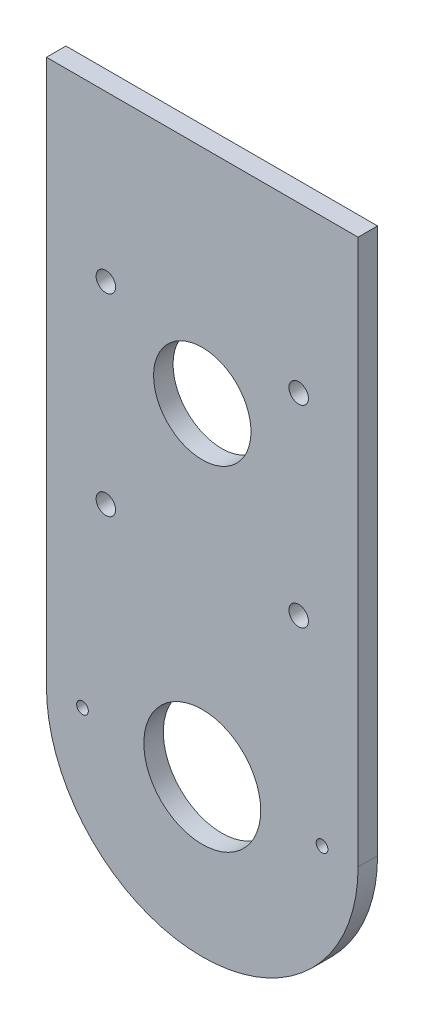
ISO-10303-21;
HEADER;
FILE_DESCRIPTION(('STEP AP214'),'2;1');
FILE_NAME('part.step','',(''),(''),'','','');
FILE_SCHEMA(('AUTOMOTIVE_DESIGN { 1 0 10303 214 1 1 1 1 }'));
ENDSEC;
DATA;
#1=APPLICATION_CONTEXT('core data for automotive mechanical design processes');
#2=APPLICATION_PROTOCOL_DEFINITION('international standard','automotive_design',2000,#1);
#3=PRODUCT_CONTEXT('',#1,'mechanical');
#4=PRODUCT('Part','Part','',(#3));
#5=PRODUCT_RELATED_PRODUCT_CATEGORY('part','',(#4));
#6=PRODUCT_DEFINITION_FORMATION('','',#4);
#7=PRODUCT_DEFINITION_CONTEXT('part definition',#1,'design');
#8=PRODUCT_DEFINITION('design','',#6,#7);
#9=PRODUCT_DEFINITION_SHAPE('','',#8);
#10=(LENGTH_UNIT() NAMED_UNIT(*) SI_UNIT(.MILLI.,.METRE.));
#11=(NAMED_UNIT(*) PLANE_ANGLE_UNIT() SI_UNIT($,.RADIAN.));
#12=(NAMED_UNIT(*) SI_UNIT($,.STERADIAN.) SOLID_ANGLE_UNIT());
#13=UNCERTAINTY_MEASURE_WITH_UNIT(LENGTH_MEASURE(1.E-05),#10,'distance_accuracy_value','');
#14=(GEOMETRIC_REPRESENTATION_CONTEXT(3) GLOBAL_UNCERTAINTY_ASSIGNED_CONTEXT((#13)) GLOBAL_UNIT_ASSIGNED_CONTEXT((#10,
#11,#12)) REPRESENTATION_CONTEXT('',''));
#15=CARTESIAN_POINT('',(0.,0.,0.));
#16=DIRECTION('',(0.,0.,1.));
#17=DIRECTION('',(1.,0.,0.));
#18=AXIS2_PLACEMENT_3D('',#15,#16,#17);
#19=CARTESIAN_POINT('',(0.,0.,5.));
#20=DIRECTION('',(0.,0.,1.));
#21=DIRECTION('',(1.,0.,0.));
#22=AXIS2_PLACEMENT_3D('',#19,#20,#21);
#23=PLANE('',#22);
#24=CARTESIAN_POINT('',(30.75,0.,5.));
#25=DIRECTION('',(0.,0.,1.));
#26=DIRECTION('',(1.,0.,0.));
#27=AXIS2_PLACEMENT_3D('',#24,#25,#26);
#28=CIRCLE('',#27,1.5);
#29=CARTESIAN_POINT('',(32.25,0.,5.));
#30=VERTEX_POINT('',#29);
#31=EDGE_CURVE('E130',#30,#30,#28,.T.);
#32=ORIENTED_EDGE('',*,*,#31,.F.);
#33=EDGE_LOOP('',(#32));
#34=FACE_BOUND('',#33,.T.);
#35=CARTESIAN_POINT('',(-30.75,0.,5.));
#36=DIRECTION('',(0.,0.,1.));
#37=DIRECTION('',(1.,0.,0.));
#38=AXIS2_PLACEMENT_3D('',#35,#36,#37);
#39=CIRCLE('',#38,1.5);
#40=CARTESIAN_POINT('',(-29.25,0.,5.));
#41=VERTEX_POINT('',#40);
#42=EDGE_CURVE('E152',#41,#41,#39,.T.);
#43=ORIENTED_EDGE('',*,*,#42,.F.);
#44=EDGE_LOOP('',(#43));
#45=FACE_BOUND('',#44,.T.);
#46=CARTESIAN_POINT('',(24.75,48.25,5.));
#47=DIRECTION('',(0.,0.,-1.));
#48=DIRECTION('',(-1.,0.,0.));
#49=AXIS2_PLACEMENT_3D('',#46,#47,#48);
#50=CIRCLE('',#49,2.5);
#51=CARTESIAN_POINT('',(22.25,48.25,5.));
#52=VERTEX_POINT('',#51);
#53=EDGE_CURVE('E126',#52,#52,#50,.T.);
#54=ORIENTED_EDGE('',*,*,#53,.T.);
#55=EDGE_LOOP('',(#54));
#56=FACE_BOUND('',#55,.T.);
#57=CARTESIAN_POINT('',(-24.75,48.25,5.));
#58=DIRECTION('',(0.,0.,-1.));
#59=DIRECTION('',(-1.,0.,0.));
#60=AXIS2_PLACEMENT_3D('',#57,#58,#59);
#61=CIRCLE('',#60,2.5);
#62=CARTESIAN_POINT('',(-27.25,48.25,5.));
#63=VERTEX_POINT('',#62);
#64=EDGE_CURVE('E133',#63,#63,#61,.T.);
#65=ORIENTED_EDGE('',*,*,#64,.T.);
#66=EDGE_LOOP('',(#65));
#67=FACE_BOUND('',#66,.T.);
#68=CARTESIAN_POINT('',(-24.75,97.75,5.));
#69=DIRECTION('',(0.,0.,-1.));
#70=DIRECTION('',(-1.,0.,0.));
#71=AXIS2_PLACEMENT_3D('',#68,#69,#70);
#72=CIRCLE('',#71,2.5);
#73=CARTESIAN_POINT('',(-27.25,97.75,5.));
#74=VERTEX_POINT('',#73);
#75=EDGE_CURVE('E139',#74,#74,#72,.T.);
#76=ORIENTED_EDGE('',*,*,#75,.T.);
#77=EDGE_LOOP('',(#76));
#78=FACE_BOUND('',#77,.T.);
#79=CARTESIAN_POINT('',(24.75,97.75,5.));
#80=DIRECTION('',(0.,0.,-1.));
#81=DIRECTION('',(-1.,0.,0.));
#82=AXIS2_PLACEMENT_3D('',#79,#80,#81);
#83=CIRCLE('',#82,2.5);
#84=CARTESIAN_POINT('',(22.25,97.75,5.));
#85=VERTEX_POINT('',#84);
#86=EDGE_CURVE('E145',#85,#85,#83,.T.);
#87=ORIENTED_EDGE('',*,*,#86,.T.);
#88=EDGE_LOOP('',(#87));
#89=FACE_BOUND('',#88,.T.);
#90=CARTESIAN_POINT('',(0.,83.,5.));
#91=DIRECTION('',(0.,0.,-1.));
#92=DIRECTION('',(-1.,0.,0.));
#93=AXIS2_PLACEMENT_3D('',#90,#91,#92);
#94=CIRCLE('',#93,12.5);
#95=CARTESIAN_POINT('',(-12.5,83.,5.));
#96=VERTEX_POINT('',#95);
#97=EDGE_CURVE('E117',#96,#96,#94,.T.);
#98=ORIENTED_EDGE('',*,*,#97,.T.);
#99=EDGE_LOOP('',(#98));
#100=FACE_BOUND('',#99,.T.);
#101=CARTESIAN_POINT('',(0.,0.,5.));
#102=DIRECTION('',(0.,0.,1.));
#103=DIRECTION('',(1.,0.,0.));
#104=AXIS2_PLACEMENT_3D('',#101,#102,#103);
#105=CIRCLE('',#104,40.);
#106=CARTESIAN_POINT('',(-40.,0.,5.));
#107=VERTEX_POINT('',#106);
#108=CARTESIAN_POINT('',(40.,0.,5.));
#109=VERTEX_POINT('',#108);
#110=EDGE_CURVE('E87',#107,#109,#105,.T.);
#111=ORIENTED_EDGE('',*,*,#110,.T.);
#112=DIRECTION('',(0.,1.,0.));
#113=VECTOR('',#112,1.);
#114=CARTESIAN_POINT('',(40.,140.,5.));
#115=LINE('',#114,#113);
#116=CARTESIAN_POINT('',(40.,140.,5.));
#117=VERTEX_POINT('',#116);
#118=EDGE_CURVE('E82',#109,#117,#115,.T.);
#119=ORIENTED_EDGE('',*,*,#118,.T.);
#120=DIRECTION('',(-1.,0.,0.));
#121=VECTOR('',#120,1.);
#122=CARTESIAN_POINT('',(-40.,140.,5.));
#123=LINE('',#122,#121);
#124=CARTESIAN_POINT('',(-40.,140.,5.));
#125=VERTEX_POINT('',#124);
#126=EDGE_CURVE('E85',#117,#125,#123,.T.);
#127=ORIENTED_EDGE('',*,*,#126,.T.);
#128=DIRECTION('',(0.,-1.,0.));
#129=VECTOR('',#128,1.);
#130=CARTESIAN_POINT('',(-40.,0.,5.));
#131=LINE('',#130,#129);
#132=EDGE_CURVE('E52',#125,#107,#131,.T.);
#133=ORIENTED_EDGE('',*,*,#132,.T.);
#134=EDGE_LOOP('',(#111,#119,#127,#133));
#135=FACE_BOUND('',#134,.T.);
#136=CARTESIAN_POINT('',(0.,0.,5.));
#137=DIRECTION('',(0.,0.,1.));
#138=DIRECTION('',(1.,0.,0.));
#139=AXIS2_PLACEMENT_3D('',#136,#137,#138);
#140=CIRCLE('',#139,15.);
#141=CARTESIAN_POINT('',(15.,0.,5.));
#142=VERTEX_POINT('',#141);
#143=EDGE_CURVE('E102',#142,#142,#140,.T.);
#144=ORIENTED_EDGE('',*,*,#143,.F.);
#145=EDGE_LOOP('',(#144));
#146=FACE_BOUND('',#145,.T.);
#147=ADVANCED_FACE('F35',(#34,#45,#56,#67,#78,#89,#100,#135,#146),#23,.T.);
#148=CARTESIAN_POINT('',(0.,0.,0.));
#149=DIRECTION('',(0.,0.,1.));
#150=DIRECTION('',(1.,0.,0.));
#151=AXIS2_PLACEMENT_3D('',#148,#149,#150);
#152=PLANE('',#151);
#153=CARTESIAN_POINT('',(30.75,0.,0.));
#154=DIRECTION('',(0.,0.,-1.));
#155=DIRECTION('',(-1.,0.,0.));
#156=AXIS2_PLACEMENT_3D('',#153,#154,#155);
#157=CIRCLE('',#156,1.5);
#158=CARTESIAN_POINT('',(29.25,0.,0.));
#159=VERTEX_POINT('',#158);
#160=EDGE_CURVE('E155',#159,#159,#157,.T.);
#161=ORIENTED_EDGE('',*,*,#160,.F.);
#162=EDGE_LOOP('',(#161));
#163=FACE_BOUND('',#162,.T.);
#164=CARTESIAN_POINT('',(-30.75,0.,0.));
#165=DIRECTION('',(0.,0.,-1.));
#166=DIRECTION('',(-1.,0.,0.));
#167=AXIS2_PLACEMENT_3D('',#164,#165,#166);
#168=CIRCLE('',#167,1.5);
#169=CARTESIAN_POINT('',(-32.25,0.,0.));
#170=VERTEX_POINT('',#169);
#171=EDGE_CURVE('E156',#170,#170,#168,.T.);
#172=ORIENTED_EDGE('',*,*,#171,.F.);
#173=EDGE_LOOP('',(#172));
#174=FACE_BOUND('',#173,.T.);
#175=CARTESIAN_POINT('',(24.75,48.25,0.));
#176=DIRECTION('',(0.,0.,-1.));
#177=DIRECTION('',(-1.,0.,0.));
#178=AXIS2_PLACEMENT_3D('',#175,#176,#177);
#179=CIRCLE('',#178,2.5);
#180=CARTESIAN_POINT('',(22.25,48.25,0.));
#181=VERTEX_POINT('',#180);
#182=EDGE_CURVE('E129',#181,#181,#179,.T.);
#183=ORIENTED_EDGE('',*,*,#182,.F.);
#184=EDGE_LOOP('',(#183));
#185=FACE_BOUND('',#184,.T.);
#186=CARTESIAN_POINT('',(-24.75,48.25,0.));
#187=DIRECTION('',(0.,0.,-1.));
#188=DIRECTION('',(-1.,0.,0.));
#189=AXIS2_PLACEMENT_3D('',#186,#187,#188);
#190=CIRCLE('',#189,2.5);
#191=CARTESIAN_POINT('',(-27.25,48.25,0.));
#192=VERTEX_POINT('',#191);
#193=EDGE_CURVE('E136',#192,#192,#190,.T.);
#194=ORIENTED_EDGE('',*,*,#193,.F.);
#195=EDGE_LOOP('',(#194));
#196=FACE_BOUND('',#195,.T.);
#197=CARTESIAN_POINT('',(-24.75,97.75,0.));
#198=DIRECTION('',(0.,0.,-1.));
#199=DIRECTION('',(-1.,0.,0.));
#200=AXIS2_PLACEMENT_3D('',#197,#198,#199);
#201=CIRCLE('',#200,2.5);
#202=CARTESIAN_POINT('',(-27.25,97.75,0.));
#203=VERTEX_POINT('',#202);
#204=EDGE_CURVE('E142',#203,#203,#201,.T.);
#205=ORIENTED_EDGE('',*,*,#204,.F.);
#206=EDGE_LOOP('',(#205));
#207=FACE_BOUND('',#206,.T.);
#208=CARTESIAN_POINT('',(24.75,97.75,0.));
#209=DIRECTION('',(0.,0.,-1.));
#210=DIRECTION('',(-1.,0.,0.));
#211=AXIS2_PLACEMENT_3D('',#208,#209,#210);
#212=CIRCLE('',#211,2.5);
#213=CARTESIAN_POINT('',(22.25,97.75,0.));
#214=VERTEX_POINT('',#213);
#215=EDGE_CURVE('E123',#214,#214,#212,.T.);
#216=ORIENTED_EDGE('',*,*,#215,.F.);
#217=EDGE_LOOP('',(#216));
#218=FACE_BOUND('',#217,.T.);
#219=CARTESIAN_POINT('',(0.,83.,0.));
#220=DIRECTION('',(0.,0.,-1.));
#221=DIRECTION('',(-1.,0.,0.));
#222=AXIS2_PLACEMENT_3D('',#219,#220,#221);
#223=CIRCLE('',#222,12.5);
#224=CARTESIAN_POINT('',(-12.5,83.,0.));
#225=VERTEX_POINT('',#224);
#226=EDGE_CURVE('E120',#225,#225,#223,.T.);
#227=ORIENTED_EDGE('',*,*,#226,.F.);
#228=EDGE_LOOP('',(#227));
#229=FACE_BOUND('',#228,.T.);
#230=CARTESIAN_POINT('',(0.,0.,0.));
#231=DIRECTION('',(0.,0.,1.));
#232=DIRECTION('',(1.,0.,0.));
#233=AXIS2_PLACEMENT_3D('',#230,#231,#232);
#234=CIRCLE('',#233,40.);
#235=CARTESIAN_POINT('',(-40.,0.,0.));
#236=VERTEX_POINT('',#235);
#237=CARTESIAN_POINT('',(40.,0.,0.));
#238=VERTEX_POINT('',#237);
#239=EDGE_CURVE('E99',#236,#238,#234,.T.);
#240=ORIENTED_EDGE('',*,*,#239,.F.);
#241=DIRECTION('',(0.,-1.,0.));
#242=VECTOR('',#241,1.);
#243=CARTESIAN_POINT('',(-40.,0.,0.));
#244=LINE('',#243,#242);
#245=CARTESIAN_POINT('',(-40.,140.,0.));
#246=VERTEX_POINT('',#245);
#247=EDGE_CURVE('E75',#246,#236,#244,.T.);
#248=ORIENTED_EDGE('',*,*,#247,.F.);
#249=DIRECTION('',(-1.,0.,0.));
#250=VECTOR('',#249,1.);
#251=CARTESIAN_POINT('',(-40.,140.,0.));
#252=LINE('',#251,#250);
#253=CARTESIAN_POINT('',(40.,140.,0.));
#254=VERTEX_POINT('',#253);
#255=EDGE_CURVE('E69',#254,#246,#252,.T.);
#256=ORIENTED_EDGE('',*,*,#255,.F.);
#257=DIRECTION('',(0.,1.,0.));
#258=VECTOR('',#257,1.);
#259=CARTESIAN_POINT('',(40.,140.,0.));
#260=LINE('',#259,#258);
#261=EDGE_CURVE('E91',#238,#254,#260,.T.);
#262=ORIENTED_EDGE('',*,*,#261,.F.);
#263=EDGE_LOOP('',(#240,#248,#256,#262));
#264=FACE_BOUND('',#263,.T.);
#265=CARTESIAN_POINT('',(0.,0.,0.));
#266=DIRECTION('',(0.,0.,1.));
#267=DIRECTION('',(1.,0.,0.));
#268=AXIS2_PLACEMENT_3D('',#265,#266,#267);
#269=CIRCLE('',#268,15.);
#270=CARTESIAN_POINT('',(15.,0.,0.));
#271=VERTEX_POINT('',#270);
#272=EDGE_CURVE('E114',#271,#271,#269,.T.);
#273=ORIENTED_EDGE('',*,*,#272,.T.);
#274=EDGE_LOOP('',(#273));
#275=FACE_BOUND('',#274,.T.);
#276=ADVANCED_FACE('F110',(#163,#174,#185,#196,#207,#218,#229,#264,#275),#152,.F.);
#277=CARTESIAN_POINT('',(0.,0.,5.));
#278=DIRECTION('',(0.,0.,-1.));
#279=DIRECTION('',(-1.,0.,0.));
#280=AXIS2_PLACEMENT_3D('',#277,#278,#279);
#281=CYLINDRICAL_SURFACE('',#280,40.);
#282=ORIENTED_EDGE('',*,*,#239,.T.);
#283=DIRECTION('',(0.,0.,-1.));
#284=VECTOR('',#283,1.);
#285=CARTESIAN_POINT('',(40.,0.,5.));
#286=LINE('',#285,#284);
#287=EDGE_CURVE('E11',#109,#238,#286,.T.);
#288=ORIENTED_EDGE('',*,*,#287,.F.);
#289=ORIENTED_EDGE('',*,*,#110,.F.);
#290=DIRECTION('',(0.,0.,-1.));
#291=VECTOR('',#290,1.);
#292=CARTESIAN_POINT('',(-40.,0.,5.));
#293=LINE('',#292,#291);
#294=EDGE_CURVE('E95',#107,#236,#293,.T.);
#295=ORIENTED_EDGE('',*,*,#294,.T.);
#296=EDGE_LOOP('',(#282,#288,#289,#295));
#297=FACE_BOUND('',#296,.T.);
#298=ADVANCED_FACE('F37',(#297),#281,.T.);
#299=CARTESIAN_POINT('',(40.,140.,5.));
#300=DIRECTION('',(-1.,0.,0.));
#301=DIRECTION('',(0.,0.,1.));
#302=AXIS2_PLACEMENT_3D('',#299,#300,#301);
#303=PLANE('',#302);
#304=ORIENTED_EDGE('',*,*,#261,.T.);
#305=DIRECTION('',(0.,0.,-1.));
#306=VECTOR('',#305,1.);
#307=CARTESIAN_POINT('',(40.,140.,5.));
#308=LINE('',#307,#306);
#309=EDGE_CURVE('E44',#117,#254,#308,.T.);
#310=ORIENTED_EDGE('',*,*,#309,.F.);
#311=ORIENTED_EDGE('',*,*,#118,.F.);
#312=ORIENTED_EDGE('',*,*,#287,.T.);
#313=EDGE_LOOP('',(#304,#310,#311,#312));
#314=FACE_BOUND('',#313,.T.);
#315=ADVANCED_FACE('F90',(#314),#303,.F.);
#316=CARTESIAN_POINT('',(-40.,140.,5.));
#317=DIRECTION('',(0.,-1.,0.));
#318=DIRECTION('',(0.,0.,-1.));
#319=AXIS2_PLACEMENT_3D('',#316,#317,#318);
#320=PLANE('',#319);
#321=ORIENTED_EDGE('',*,*,#255,.T.);
#322=DIRECTION('',(0.,0.,-1.));
#323=VECTOR('',#322,1.);
#324=CARTESIAN_POINT('',(-40.,140.,5.));
#325=LINE('',#324,#323);
#326=EDGE_CURVE('E92',#125,#246,#325,.T.);
#327=ORIENTED_EDGE('',*,*,#326,.F.);
#328=ORIENTED_EDGE('',*,*,#126,.F.);
#329=ORIENTED_EDGE('',*,*,#309,.T.);
#330=EDGE_LOOP('',(#321,#327,#328,#329));
#331=FACE_BOUND('',#330,.T.);
#332=ADVANCED_FACE('F93',(#331),#320,.F.);
#333=CARTESIAN_POINT('',(-40.,0.,5.));
#334=DIRECTION('',(1.,0.,0.));
#335=DIRECTION('',(0.,0.,-1.));
#336=AXIS2_PLACEMENT_3D('',#333,#334,#335);
#337=PLANE('',#336);
#338=ORIENTED_EDGE('',*,*,#247,.T.);
#339=ORIENTED_EDGE('',*,*,#294,.F.);
#340=ORIENTED_EDGE('',*,*,#132,.F.);
#341=ORIENTED_EDGE('',*,*,#326,.T.);
#342=EDGE_LOOP('',(#338,#339,#340,#341));
#343=FACE_BOUND('',#342,.T.);
#344=ADVANCED_FACE('F107',(#343),#337,.F.);
#345=CARTESIAN_POINT('',(0.,0.,5.));
#346=DIRECTION('',(0.,0.,-1.));
#347=DIRECTION('',(-1.,0.,0.));
#348=AXIS2_PLACEMENT_3D('',#345,#346,#347);
#349=CYLINDRICAL_SURFACE('',#348,15.);
#350=ORIENTED_EDGE('',*,*,#143,.T.);
#351=EDGE_LOOP('',(#350));
#352=FACE_BOUND('',#351,.T.);
#353=ORIENTED_EDGE('',*,*,#272,.F.);
#354=EDGE_LOOP('',(#353));
#355=FACE_BOUND('',#354,.T.);
#356=ADVANCED_FACE('F182',(#352,#355),#349,.F.);
#357=CARTESIAN_POINT('',(0.,83.,5.));
#358=DIRECTION('',(0.,0.,-1.));
#359=DIRECTION('',(-1.,0.,0.));
#360=AXIS2_PLACEMENT_3D('',#357,#358,#359);
#361=CYLINDRICAL_SURFACE('',#360,12.5);
#362=ORIENTED_EDGE('',*,*,#97,.F.);
#363=EDGE_LOOP('',(#362));
#364=FACE_BOUND('',#363,.T.);
#365=ORIENTED_EDGE('',*,*,#226,.T.);
#366=EDGE_LOOP('',(#365));
#367=FACE_BOUND('',#366,.T.);
#368=ADVANCED_FACE('F179',(#364,#367),#361,.F.);
#369=CARTESIAN_POINT('',(24.75,97.75,5.));
#370=DIRECTION('',(0.,0.,-1.));
#371=DIRECTION('',(-1.,0.,0.));
#372=AXIS2_PLACEMENT_3D('',#369,#370,#371);
#373=CYLINDRICAL_SURFACE('',#372,2.5);
#374=ORIENTED_EDGE('',*,*,#86,.F.);
#375=EDGE_LOOP('',(#374));
#376=FACE_BOUND('',#375,.T.);
#377=ORIENTED_EDGE('',*,*,#215,.T.);
#378=EDGE_LOOP('',(#377));
#379=FACE_BOUND('',#378,.T.);
#380=ADVANCED_FACE('F181',(#376,#379),#373,.F.);
#381=CARTESIAN_POINT('',(-24.75,97.75,5.));
#382=DIRECTION('',(0.,0.,-1.));
#383=DIRECTION('',(-1.,0.,0.));
#384=AXIS2_PLACEMENT_3D('',#381,#382,#383);
#385=CYLINDRICAL_SURFACE('',#384,2.5);
#386=ORIENTED_EDGE('',*,*,#75,.F.);
#387=EDGE_LOOP('',(#386));
#388=FACE_BOUND('',#387,.T.);
#389=ORIENTED_EDGE('',*,*,#204,.T.);
#390=EDGE_LOOP('',(#389));
#391=FACE_BOUND('',#390,.T.);
#392=ADVANCED_FACE('F189',(#388,#391),#385,.F.);
#393=CARTESIAN_POINT('',(-24.75,48.25,5.));
#394=DIRECTION('',(0.,0.,-1.));
#395=DIRECTION('',(-1.,0.,0.));
#396=AXIS2_PLACEMENT_3D('',#393,#394,#395);
#397=CYLINDRICAL_SURFACE('',#396,2.5);
#398=ORIENTED_EDGE('',*,*,#64,.F.);
#399=EDGE_LOOP('',(#398));
#400=FACE_BOUND('',#399,.T.);
#401=ORIENTED_EDGE('',*,*,#193,.T.);
#402=EDGE_LOOP('',(#401));
#403=FACE_BOUND('',#402,.T.);
#404=ADVANCED_FACE('F249',(#400,#403),#397,.F.);
#405=CARTESIAN_POINT('',(24.75,48.25,5.));
#406=DIRECTION('',(0.,0.,-1.));
#407=DIRECTION('',(-1.,0.,0.));
#408=AXIS2_PLACEMENT_3D('',#405,#406,#407);
#409=CYLINDRICAL_SURFACE('',#408,2.5);
#410=ORIENTED_EDGE('',*,*,#53,.F.);
#411=EDGE_LOOP('',(#410));
#412=FACE_BOUND('',#411,.T.);
#413=ORIENTED_EDGE('',*,*,#182,.T.);
#414=EDGE_LOOP('',(#413));
#415=FACE_BOUND('',#414,.T.);
#416=ADVANCED_FACE('F230',(#412,#415),#409,.F.);
#417=CARTESIAN_POINT('',(-30.75,0.,10.));
#418=DIRECTION('',(0.,0.,-1.));
#419=DIRECTION('',(-1.,0.,0.));
#420=AXIS2_PLACEMENT_3D('',#417,#418,#419);
#421=CYLINDRICAL_SURFACE('',#420,1.5);
#422=ORIENTED_EDGE('',*,*,#42,.T.);
#423=EDGE_LOOP('',(#422));
#424=FACE_BOUND('',#423,.T.);
#425=ORIENTED_EDGE('',*,*,#171,.T.);
#426=EDGE_LOOP('',(#425));
#427=FACE_BOUND('',#426,.T.);
#428=ADVANCED_FACE('F225',(#424,#427),#421,.F.);
#429=CARTESIAN_POINT('',(30.75,0.,10.));
#430=DIRECTION('',(0.,0.,-1.));
#431=DIRECTION('',(-1.,0.,0.));
#432=AXIS2_PLACEMENT_3D('',#429,#430,#431);
#433=CYLINDRICAL_SURFACE('',#432,1.5);
#434=ORIENTED_EDGE('',*,*,#31,.T.);
#435=EDGE_LOOP('',(#434));
#436=FACE_BOUND('',#435,.T.);
#437=ORIENTED_EDGE('',*,*,#160,.T.);
#438=EDGE_LOOP('',(#437));
#439=FACE_BOUND('',#438,.T.);
#440=ADVANCED_FACE('F162',(#436,#439),#433,.F.);
#441=CLOSED_SHELL('',(#147,#276,#298,#315,#332,#344,#356,#368,#380,#392,#404,#416,#428,#440));
#442=MANIFOLD_SOLID_BREP('B2',#441);
#443=ADVANCED_BREP_SHAPE_REPRESENTATION('',(#18,#442),#14);
#444=SHAPE_DEFINITION_REPRESENTATION(#9,#443);
ENDSEC;
END-ISO-10303-21;
